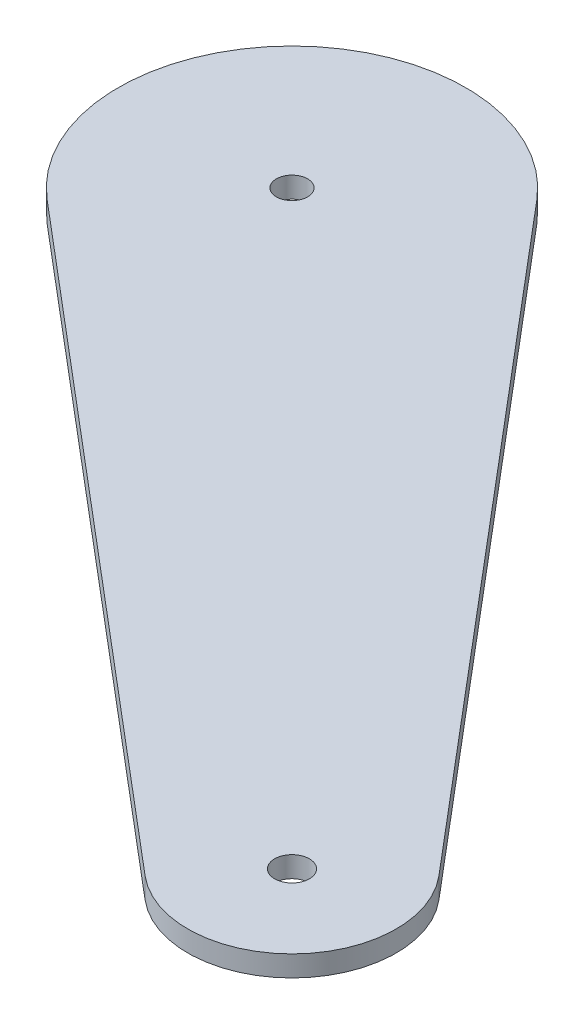
ISO-10303-21;
HEADER;
FILE_DESCRIPTION(('STEP AP214'),'2;1');
FILE_NAME('part.step','',(''),(''),'','','');
FILE_SCHEMA(('AUTOMOTIVE_DESIGN { 1 0 10303 214 1 1 1 1 }'));
ENDSEC;
DATA;
#1=APPLICATION_CONTEXT('core data for automotive mechanical design processes');
#2=APPLICATION_PROTOCOL_DEFINITION('international standard','automotive_design',2000,#1);
#3=PRODUCT_CONTEXT('',#1,'mechanical');
#4=PRODUCT('Part','Part','',(#3));
#5=PRODUCT_RELATED_PRODUCT_CATEGORY('part','',(#4));
#6=PRODUCT_DEFINITION_FORMATION('','',#4);
#7=PRODUCT_DEFINITION_CONTEXT('part definition',#1,'design');
#8=PRODUCT_DEFINITION('design','',#6,#7);
#9=PRODUCT_DEFINITION_SHAPE('','',#8);
#10=(LENGTH_UNIT() NAMED_UNIT(*) SI_UNIT(.MILLI.,.METRE.));
#11=(NAMED_UNIT(*) PLANE_ANGLE_UNIT() SI_UNIT($,.RADIAN.));
#12=(NAMED_UNIT(*) SI_UNIT($,.STERADIAN.) SOLID_ANGLE_UNIT());
#13=UNCERTAINTY_MEASURE_WITH_UNIT(LENGTH_MEASURE(1.E-05),#10,'distance_accuracy_value','');
#14=(GEOMETRIC_REPRESENTATION_CONTEXT(3) GLOBAL_UNCERTAINTY_ASSIGNED_CONTEXT((#13)) GLOBAL_UNIT_ASSIGNED_CONTEXT((#10,
#11,#12)) REPRESENTATION_CONTEXT('',''));
#15=CARTESIAN_POINT('',(0.,0.,0.));
#16=DIRECTION('',(0.,0.,1.));
#17=DIRECTION('',(1.,0.,0.));
#18=AXIS2_PLACEMENT_3D('',#15,#16,#17);
#19=CARTESIAN_POINT('',(-12.9144341357622,3.,15.2714567397174));
#20=DIRECTION('',(0.645721706788111,0.,-0.763572836985869));
#21=DIRECTION('',(-0.763572836985869,0.,-0.645721706788111));
#22=AXIS2_PLACEMENT_3D('',#19,#20,#21);
#23=PLANE('',#22);
#24=DIRECTION('',(0.763572836985869,0.,0.645721706788111));
#25=VECTOR('',#24,1.);
#26=CARTESIAN_POINT('',(-12.9144341357622,0.,15.2714567397174));
#27=LINE('',#26,#25);
#28=CARTESIAN_POINT('',(-58.5694495408956,0.,-23.3370859465461));
#29=VERTEX_POINT('',#28);
#30=CARTESIAN_POINT('',(32.7405812693714,0.,53.8799994259806));
#31=VERTEX_POINT('',#30);
#32=EDGE_CURVE('E105',#29,#31,#27,.T.);
#33=ORIENTED_EDGE('',*,*,#32,.T.);
#34=DIRECTION('',(0.,-1.,0.));
#35=VECTOR('',#34,1.);
#36=CARTESIAN_POINT('',(32.7405812693714,3.,53.8799994259806));
#37=LINE('',#36,#35);
#38=CARTESIAN_POINT('',(32.7405812693714,3.,53.8799994259806));
#39=VERTEX_POINT('',#38);
#40=EDGE_CURVE('E11',#39,#31,#37,.T.);
#41=ORIENTED_EDGE('',*,*,#40,.F.);
#42=DIRECTION('',(0.763572836985869,0.,0.645721706788111));
#43=VECTOR('',#42,1.);
#44=CARTESIAN_POINT('',(-12.9144341357622,3.,15.2714567397174));
#45=LINE('',#44,#43);
#46=CARTESIAN_POINT('',(-58.5694495408956,3.,-23.3370859465461));
#47=VERTEX_POINT('',#46);
#48=EDGE_CURVE('E90',#47,#39,#45,.T.);
#49=ORIENTED_EDGE('',*,*,#48,.F.);
#50=DIRECTION('',(0.,-1.,0.));
#51=VECTOR('',#50,1.);
#52=CARTESIAN_POINT('',(-58.5694495408956,3.,-23.3370859465461));
#53=LINE('',#52,#51);
#54=EDGE_CURVE('E101',#47,#29,#53,.T.);
#55=ORIENTED_EDGE('',*,*,#54,.T.);
#56=EDGE_LOOP('',(#33,#41,#49,#55));
#57=FACE_BOUND('',#56,.T.);
#58=ADVANCED_FACE('F43',(#57),#23,.F.);
#59=CARTESIAN_POINT('',(42.4264068711934,3.,42.4264068711923));
#60=DIRECTION('',(0.,-1.,0.));
#61=DIRECTION('',(0.,0.,-1.));
#62=AXIS2_PLACEMENT_3D('',#59,#60,#61);
#63=CYLINDRICAL_SURFACE('',#62,15.);
#64=CARTESIAN_POINT('',(42.4264068711934,0.,42.4264068711923));
#65=DIRECTION('',(0.,1.,0.));
#66=DIRECTION('',(0.,0.,1.));
#67=AXIS2_PLACEMENT_3D('',#64,#65,#66);
#68=CIRCLE('',#67,15.);
#69=CARTESIAN_POINT('',(53.8799994259812,0.,32.740581269371));
#70=VERTEX_POINT('',#69);
#71=EDGE_CURVE('E95',#31,#70,#68,.T.);
#72=ORIENTED_EDGE('',*,*,#71,.T.);
#73=DIRECTION('',(0.,-1.,0.));
#74=VECTOR('',#73,1.);
#75=CARTESIAN_POINT('',(53.8799994259812,3.,32.740581269371));
#76=LINE('',#75,#74);
#77=CARTESIAN_POINT('',(53.8799994259812,3.,32.740581269371));
#78=VERTEX_POINT('',#77);
#79=EDGE_CURVE('E51',#78,#70,#76,.T.);
#80=ORIENTED_EDGE('',*,*,#79,.F.);
#81=CARTESIAN_POINT('',(42.4264068711934,3.,42.4264068711923));
#82=DIRECTION('',(0.,1.,0.));
#83=DIRECTION('',(0.,0.,1.));
#84=AXIS2_PLACEMENT_3D('',#81,#82,#83);
#85=CIRCLE('',#84,15.);
#86=EDGE_CURVE('E85',#39,#78,#85,.T.);
#87=ORIENTED_EDGE('',*,*,#86,.F.);
#88=ORIENTED_EDGE('',*,*,#40,.T.);
#89=EDGE_LOOP('',(#72,#80,#87,#88));
#90=FACE_BOUND('',#89,.T.);
#91=ADVANCED_FACE('F94',(#90),#63,.T.);
#92=CARTESIAN_POINT('',(15.2714567397174,3.,-12.9144341357622));
#93=DIRECTION('',(0.763572836985869,0.,-0.645721706788111));
#94=DIRECTION('',(-0.645721706788111,0.,-0.763572836985869));
#95=AXIS2_PLACEMENT_3D('',#92,#93,#94);
#96=PLANE('',#95);
#97=DIRECTION('',(0.645721706788111,0.,0.763572836985869));
#98=VECTOR('',#97,1.);
#99=CARTESIAN_POINT('',(15.2714567397174,0.,-12.9144341357622));
#100=LINE('',#99,#98);
#101=CARTESIAN_POINT('',(-23.3370859465461,0.,-58.5694495408956));
#102=VERTEX_POINT('',#101);
#103=EDGE_CURVE('E110',#102,#70,#100,.T.);
#104=ORIENTED_EDGE('',*,*,#103,.F.);
#105=DIRECTION('',(0.,-1.,0.));
#106=VECTOR('',#105,1.);
#107=CARTESIAN_POINT('',(-23.3370859465461,3.,-58.5694495408956));
#108=LINE('',#107,#106);
#109=CARTESIAN_POINT('',(-23.3370859465461,3.,-58.5694495408956));
#110=VERTEX_POINT('',#109);
#111=EDGE_CURVE('E75',#110,#102,#108,.T.);
#112=ORIENTED_EDGE('',*,*,#111,.F.);
#113=DIRECTION('',(0.645721706788111,0.,0.763572836985869));
#114=VECTOR('',#113,1.);
#115=CARTESIAN_POINT('',(15.2714567397174,3.,-12.9144341357622));
#116=LINE('',#115,#114);
#117=EDGE_CURVE('E88',#110,#78,#116,.T.);
#118=ORIENTED_EDGE('',*,*,#117,.T.);
#119=ORIENTED_EDGE('',*,*,#79,.T.);
#120=EDGE_LOOP('',(#104,#112,#118,#119));
#121=FACE_BOUND('',#120,.T.);
#122=ADVANCED_FACE('F99',(#121),#96,.T.);
#123=CARTESIAN_POINT('',(-42.4264068711929,3.,-42.4264068711928));
#124=DIRECTION('',(0.,-1.,0.));
#125=DIRECTION('',(0.,0.,-1.));
#126=AXIS2_PLACEMENT_3D('',#123,#124,#125);
#127=CYLINDRICAL_SURFACE('',#126,25.);
#128=CARTESIAN_POINT('',(-42.4264068711929,0.,-42.4264068711928));
#129=DIRECTION('',(0.,1.,0.));
#130=DIRECTION('',(0.,0.,1.));
#131=AXIS2_PLACEMENT_3D('',#128,#129,#130);
#132=CIRCLE('',#131,25.);
#133=EDGE_CURVE('E78',#102,#29,#132,.T.);
#134=ORIENTED_EDGE('',*,*,#133,.T.);
#135=ORIENTED_EDGE('',*,*,#54,.F.);
#136=CARTESIAN_POINT('',(-42.4264068711929,3.,-42.4264068711928));
#137=DIRECTION('',(0.,1.,0.));
#138=DIRECTION('',(0.,0.,1.));
#139=AXIS2_PLACEMENT_3D('',#136,#137,#138);
#140=CIRCLE('',#139,25.);
#141=EDGE_CURVE('E59',#110,#47,#140,.T.);
#142=ORIENTED_EDGE('',*,*,#141,.F.);
#143=ORIENTED_EDGE('',*,*,#111,.T.);
#144=EDGE_LOOP('',(#134,#135,#142,#143));
#145=FACE_BOUND('',#144,.T.);
#146=ADVANCED_FACE('F129',(#145),#127,.T.);
#147=CARTESIAN_POINT('',(0.,3.,0.));
#148=DIRECTION('',(0.,1.,0.));
#149=DIRECTION('',(0.,0.,1.));
#150=AXIS2_PLACEMENT_3D('',#147,#148,#149);
#151=PLANE('',#150);
#152=CARTESIAN_POINT('',(-42.4264068711929,3.,-42.4264068711928));
#153=DIRECTION('',(0.,1.,0.));
#154=DIRECTION('',(0.,0.,1.));
#155=AXIS2_PLACEMENT_3D('',#152,#153,#154);
#156=CIRCLE('',#155,2.25);
#157=CARTESIAN_POINT('',(-42.4264068711929,3.,-40.1764068711928));
#158=VERTEX_POINT('',#157);
#159=EDGE_CURVE('E193',#158,#158,#156,.T.);
#160=ORIENTED_EDGE('',*,*,#159,.F.);
#161=EDGE_LOOP('',(#160));
#162=FACE_BOUND('',#161,.T.);
#163=CARTESIAN_POINT('',(42.4264068711934,3.,42.4264068711923));
#164=DIRECTION('',(0.,1.,0.));
#165=DIRECTION('',(0.,0.,1.));
#166=AXIS2_PLACEMENT_3D('',#163,#164,#165);
#167=CIRCLE('',#166,2.5);
#168=CARTESIAN_POINT('',(42.4264068711934,3.,44.9264068711923));
#169=VERTEX_POINT('',#168);
#170=EDGE_CURVE('E198',#169,#169,#167,.T.);
#171=ORIENTED_EDGE('',*,*,#170,.F.);
#172=EDGE_LOOP('',(#171));
#173=FACE_BOUND('',#172,.T.);
#174=ORIENTED_EDGE('',*,*,#48,.T.);
#175=ORIENTED_EDGE('',*,*,#86,.T.);
#176=ORIENTED_EDGE('',*,*,#117,.F.);
#177=ORIENTED_EDGE('',*,*,#141,.T.);
#178=EDGE_LOOP('',(#174,#175,#176,#177));
#179=FACE_BOUND('',#178,.T.);
#180=ADVANCED_FACE('F86',(#162,#173,#179),#151,.T.);
#181=CARTESIAN_POINT('',(0.,0.,0.));
#182=DIRECTION('',(0.,1.,0.));
#183=DIRECTION('',(0.,0.,1.));
#184=AXIS2_PLACEMENT_3D('',#181,#182,#183);
#185=PLANE('',#184);
#186=CARTESIAN_POINT('',(-42.4264068711929,0.,-42.4264068711928));
#187=DIRECTION('',(0.,1.,0.));
#188=DIRECTION('',(0.,0.,1.));
#189=AXIS2_PLACEMENT_3D('',#186,#187,#188);
#190=CIRCLE('',#189,2.25);
#191=CARTESIAN_POINT('',(-42.4264068711929,0.,-40.1764068711928));
#192=VERTEX_POINT('',#191);
#193=EDGE_CURVE('E108',#192,#192,#190,.T.);
#194=ORIENTED_EDGE('',*,*,#193,.T.);
#195=EDGE_LOOP('',(#194));
#196=FACE_BOUND('',#195,.T.);
#197=CARTESIAN_POINT('',(42.4264068711934,0.,42.4264068711923));
#198=DIRECTION('',(0.,1.,0.));
#199=DIRECTION('',(0.,0.,1.));
#200=AXIS2_PLACEMENT_3D('',#197,#198,#199);
#201=CIRCLE('',#200,2.5);
#202=CARTESIAN_POINT('',(42.4264068711934,0.,44.9264068711923));
#203=VERTEX_POINT('',#202);
#204=EDGE_CURVE('E194',#203,#203,#201,.T.);
#205=ORIENTED_EDGE('',*,*,#204,.T.);
#206=EDGE_LOOP('',(#205));
#207=FACE_BOUND('',#206,.T.);
#208=ORIENTED_EDGE('',*,*,#32,.F.);
#209=ORIENTED_EDGE('',*,*,#133,.F.);
#210=ORIENTED_EDGE('',*,*,#103,.T.);
#211=ORIENTED_EDGE('',*,*,#71,.F.);
#212=EDGE_LOOP('',(#208,#209,#210,#211));
#213=FACE_BOUND('',#212,.T.);
#214=ADVANCED_FACE('F117',(#196,#207,#213),#185,.F.);
#215=CARTESIAN_POINT('',(42.4264068711934,0.,42.4264068711923));
#216=DIRECTION('',(0.,1.,0.));
#217=DIRECTION('',(0.,0.,1.));
#218=AXIS2_PLACEMENT_3D('',#215,#216,#217);
#219=CYLINDRICAL_SURFACE('',#218,2.5);
#220=ORIENTED_EDGE('',*,*,#204,.F.);
#221=EDGE_LOOP('',(#220));
#222=FACE_BOUND('',#221,.T.);
#223=ORIENTED_EDGE('',*,*,#170,.T.);
#224=EDGE_LOOP('',(#223));
#225=FACE_BOUND('',#224,.T.);
#226=ADVANCED_FACE('F119',(#222,#225),#219,.F.);
#227=CARTESIAN_POINT('',(-42.4264068711929,0.,-42.4264068711928));
#228=DIRECTION('',(0.,1.,0.));
#229=DIRECTION('',(0.,0.,1.));
#230=AXIS2_PLACEMENT_3D('',#227,#228,#229);
#231=CYLINDRICAL_SURFACE('',#230,2.25);
#232=ORIENTED_EDGE('',*,*,#193,.F.);
#233=EDGE_LOOP('',(#232));
#234=FACE_BOUND('',#233,.T.);
#235=ORIENTED_EDGE('',*,*,#159,.T.);
#236=EDGE_LOOP('',(#235));
#237=FACE_BOUND('',#236,.T.);
#238=ADVANCED_FACE('F126',(#234,#237),#231,.F.);
#239=CLOSED_SHELL('',(#58,#91,#122,#146,#180,#214,#226,#238));
#240=MANIFOLD_SOLID_BREP('B2',#239);
#241=ADVANCED_BREP_SHAPE_REPRESENTATION('',(#18,#240),#14);
#242=SHAPE_DEFINITION_REPRESENTATION(#9,#241);
ENDSEC;
END-ISO-10303-21;
